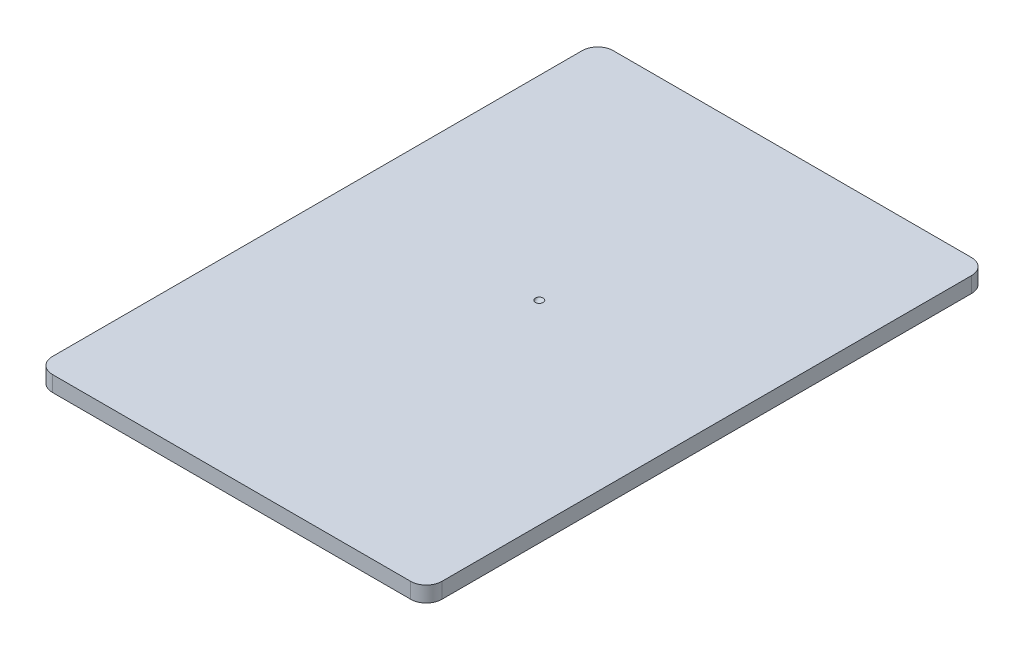
ISO-10303-21;
HEADER;
FILE_DESCRIPTION(('STEP AP214'),'2;1');
FILE_NAME('part.step','',(''),(''),'','','');
FILE_SCHEMA(('AUTOMOTIVE_DESIGN { 1 0 10303 214 1 1 1 1 }'));
ENDSEC;
DATA;
#1=APPLICATION_CONTEXT('core data for automotive mechanical design processes');
#2=APPLICATION_PROTOCOL_DEFINITION('international standard','automotive_design',2000,#1);
#3=PRODUCT_CONTEXT('',#1,'mechanical');
#4=PRODUCT('Part','Part','',(#3));
#5=PRODUCT_RELATED_PRODUCT_CATEGORY('part','',(#4));
#6=PRODUCT_DEFINITION_FORMATION('','',#4);
#7=PRODUCT_DEFINITION_CONTEXT('part definition',#1,'design');
#8=PRODUCT_DEFINITION('design','',#6,#7);
#9=PRODUCT_DEFINITION_SHAPE('','',#8);
#10=(LENGTH_UNIT() NAMED_UNIT(*) SI_UNIT(.MILLI.,.METRE.));
#11=(NAMED_UNIT(*) PLANE_ANGLE_UNIT() SI_UNIT($,.RADIAN.));
#12=(NAMED_UNIT(*) SI_UNIT($,.STERADIAN.) SOLID_ANGLE_UNIT());
#13=UNCERTAINTY_MEASURE_WITH_UNIT(LENGTH_MEASURE(1.E-05),#10,'distance_accuracy_value','');
#14=(GEOMETRIC_REPRESENTATION_CONTEXT(3) GLOBAL_UNCERTAINTY_ASSIGNED_CONTEXT((#13)) GLOBAL_UNIT_ASSIGNED_CONTEXT((#10,
#11,#12)) REPRESENTATION_CONTEXT('',''));
#15=CARTESIAN_POINT('',(0.,0.,0.));
#16=DIRECTION('',(0.,0.,1.));
#17=DIRECTION('',(1.,0.,0.));
#18=AXIS2_PLACEMENT_3D('',#15,#16,#17);
#19=CARTESIAN_POINT('',(0.,0.,0.));
#20=DIRECTION('',(0.,1.,0.));
#21=DIRECTION('',(0.,0.,1.));
#22=AXIS2_PLACEMENT_3D('',#19,#20,#21);
#23=PLANE('',#22);
#24=DIRECTION('',(0.,0.,-1.));
#25=VECTOR('',#24,1.);
#26=CARTESIAN_POINT('',(-25.,0.,0.));
#27=LINE('',#26,#25);
#28=CARTESIAN_POINT('',(-25.,0.,34.));
#29=VERTEX_POINT('',#28);
#30=CARTESIAN_POINT('',(-25.,0.,-34.));
#31=VERTEX_POINT('',#30);
#32=EDGE_CURVE('E102',#29,#31,#27,.T.);
#33=ORIENTED_EDGE('',*,*,#32,.T.);
#34=CARTESIAN_POINT('',(-23.,0.,-34.));
#35=DIRECTION('',(0.,1.,0.));
#36=DIRECTION('',(0.,0.,1.));
#37=AXIS2_PLACEMENT_3D('',#34,#35,#36);
#38=CIRCLE('',#37,2.);
#39=CARTESIAN_POINT('',(-23.,0.,-36.));
#40=VERTEX_POINT('',#39);
#41=EDGE_CURVE('E139',#31,#40,#38,.F.);
#42=ORIENTED_EDGE('',*,*,#41,.T.);
#43=DIRECTION('',(1.,0.,0.));
#44=VECTOR('',#43,1.);
#45=CARTESIAN_POINT('',(0.,0.,-36.));
#46=LINE('',#45,#44);
#47=CARTESIAN_POINT('',(23.,0.,-36.));
#48=VERTEX_POINT('',#47);
#49=EDGE_CURVE('E120',#40,#48,#46,.T.);
#50=ORIENTED_EDGE('',*,*,#49,.T.);
#51=CARTESIAN_POINT('',(23.,0.,-34.));
#52=DIRECTION('',(0.,1.,0.));
#53=DIRECTION('',(0.,0.,1.));
#54=AXIS2_PLACEMENT_3D('',#51,#52,#53);
#55=CIRCLE('',#54,2.);
#56=CARTESIAN_POINT('',(25.,0.,-34.));
#57=VERTEX_POINT('',#56);
#58=EDGE_CURVE('E137',#48,#57,#55,.F.);
#59=ORIENTED_EDGE('',*,*,#58,.T.);
#60=DIRECTION('',(0.,0.,-1.));
#61=VECTOR('',#60,1.);
#62=CARTESIAN_POINT('',(25.,0.,0.));
#63=LINE('',#62,#61);
#64=CARTESIAN_POINT('',(25.,0.,34.));
#65=VERTEX_POINT('',#64);
#66=EDGE_CURVE('E171',#65,#57,#63,.T.);
#67=ORIENTED_EDGE('',*,*,#66,.F.);
#68=CARTESIAN_POINT('',(23.,0.,34.));
#69=DIRECTION('',(0.,1.,0.));
#70=DIRECTION('',(0.,0.,1.));
#71=AXIS2_PLACEMENT_3D('',#68,#69,#70);
#72=CIRCLE('',#71,2.);
#73=CARTESIAN_POINT('',(23.,0.,36.));
#74=VERTEX_POINT('',#73);
#75=EDGE_CURVE('E109',#65,#74,#72,.F.);
#76=ORIENTED_EDGE('',*,*,#75,.T.);
#77=DIRECTION('',(1.,0.,0.));
#78=VECTOR('',#77,1.);
#79=CARTESIAN_POINT('',(0.,0.,36.));
#80=LINE('',#79,#78);
#81=CARTESIAN_POINT('',(-23.,0.,36.));
#82=VERTEX_POINT('',#81);
#83=EDGE_CURVE('E104',#82,#74,#80,.T.);
#84=ORIENTED_EDGE('',*,*,#83,.F.);
#85=CARTESIAN_POINT('',(-23.,0.,34.));
#86=DIRECTION('',(0.,1.,0.));
#87=DIRECTION('',(0.,0.,1.));
#88=AXIS2_PLACEMENT_3D('',#85,#86,#87);
#89=CIRCLE('',#88,2.);
#90=EDGE_CURVE('E99',#82,#29,#89,.F.);
#91=ORIENTED_EDGE('',*,*,#90,.T.);
#92=EDGE_LOOP('',(#33,#42,#50,#59,#67,#76,#84,#91));
#93=FACE_BOUND('',#92,.T.);
#94=CARTESIAN_POINT('',(0.,0.,0.));
#95=CARTESIAN_POINT('',(-0.0771284861220123,0.,-6.51707812193375E-06));
#96=CARTESIAN_POINT('',(-0.154336472293646,0.,-0.00596909769444245));
#97=CARTESIAN_POINT('',(-0.307776338679886,0.,-0.0298357654860756));
#98=CARTESIAN_POINT('',(-0.383986045542524,0.,-0.0478795306023025));
#99=CARTESIAN_POINT('',(-0.532773063591081,0.,-0.0956273852799887));
#100=CARTESIAN_POINT('',(-0.605345617246968,0.,-0.125346319515953));
#101=CARTESIAN_POINT('',(-0.750479253186786,0.,-0.198504140063536));
#102=CARTESIAN_POINT('',(-0.822591055264373,0.,-0.242837834582251));
#103=CARTESIAN_POINT('',(-0.95833876613347,0.,-0.342977215639288));
#104=CARTESIAN_POINT('',(-1.02197514626769,0.,-0.398782263783112));
#105=CARTESIAN_POINT('',(-1.13897895791361,0.,-0.520285887357688));
#106=CARTESIAN_POINT('',(-1.19234614358489,0.,-0.585984699574101));
#107=CARTESIAN_POINT('',(-1.28729318871684,0.,-0.725409726819562));
#108=CARTESIAN_POINT('',(-1.32887295663568,0.,-0.799136004184258));
#109=CARTESIAN_POINT('',(-1.39906465504289,0.,-0.952522541409116));
#110=CARTESIAN_POINT('',(-1.42767663632145,0.,-1.03218277802666));
#111=CARTESIAN_POINT('',(-1.47112065487863,0.,-1.19517612476));
#112=CARTESIAN_POINT('',(-1.48595269122697,0.,-1.27850923512375));
#113=CARTESIAN_POINT('',(-1.5014158174795,0.,-1.44648277737623));
#114=CARTESIAN_POINT('',(-1.50204690366182,0.,-1.53112320960757));
#115=CARTESIAN_POINT('',(-1.48909019936491,0.,-1.69930862621409));
#116=CARTESIAN_POINT('',(-1.4755024172991,0.,-1.78285361123742));
#117=CARTESIAN_POINT('',(-1.43449370620639,0.,-1.94647660285148));
#118=CARTESIAN_POINT('',(-1.40707277512337,0.,-2.02655460892688));
#119=CARTESIAN_POINT('',(-1.33917615329197,0.,-2.18097047332425));
#120=CARTESIAN_POINT('',(-1.2987004586991,0.,-2.25530832995579));
#121=CARTESIAN_POINT('',(-1.20584330333763,0.,-2.39613362907361));
#122=CARTESIAN_POINT('',(-1.1534618436842,0.,-2.4626210722952));
#123=CARTESIAN_POINT('',(-1.03828011772457,0.,-2.58585816261425));
#124=CARTESIAN_POINT('',(-0.975479852534744,0.,-2.6426078107551));
#125=CARTESIAN_POINT('',(-0.841243224103243,0.,-2.74475836618779));
#126=CARTESIAN_POINT('',(-0.769806860556362,0.,-2.79015927307856));
#127=CARTESIAN_POINT('',(-0.620325902553234,0.,-2.86832354640753));
#128=CARTESIAN_POINT('',(-0.542281307856237,0.,-2.90108691238532));
#129=CARTESIAN_POINT('',(-0.381799347014219,0.,-2.95304604585158));
#130=CARTESIAN_POINT('',(-0.299361980895064,0.,-2.97224181341994));
#131=CARTESIAN_POINT('',(-0.132434633322779,0.,-2.99652083859623));
#132=CARTESIAN_POINT('',(-0.0479446519203126,0.,-3.00160409655249));
#133=CARTESIAN_POINT('',(0.120689504536792,0.,-2.99751380483414));
#134=CARTESIAN_POINT('',(0.204833679597694,0.,-2.98834025541782));
#135=CARTESIAN_POINT('',(0.370387624395154,0.,-2.95599675850099));
#136=CARTESIAN_POINT('',(0.451797393965137,0.,-2.93282681014785));
#137=CARTESIAN_POINT('',(0.609571543502221,0.,-2.87314823938117));
#138=CARTESIAN_POINT('',(0.685935923132827,0.,-2.83663961607803));
#139=CARTESIAN_POINT('',(0.831451512192913,0.,-2.75132007676759));
#140=CARTESIAN_POINT('',(0.900602723023714,0.,-2.7025091631503));
#141=CARTESIAN_POINT('',(1.02972898005369,0.,-2.59397064649189));
#142=CARTESIAN_POINT('',(1.08970402786942,0.,-2.53424304537395));
#143=CARTESIAN_POINT('',(1.1987754925542,0.,-2.40556660660667));
#144=CARTESIAN_POINT('',(1.24787190347648,0.,-2.33661776391662));
#145=CARTESIAN_POINT('',(1.33379234840884,0.,-2.1914560859144));
#146=CARTESIAN_POINT('',(1.37061637871639,0.,-2.11524324841072));
#147=CARTESIAN_POINT('',(1.430946731549,0.,-1.95771720758818));
#148=CARTESIAN_POINT('',(1.45445306939016,0.,-1.87640401013515));
#149=CARTESIAN_POINT('',(1.48748064042312,0.,-1.71098516840337));
#150=CARTESIAN_POINT('',(1.49700186898191,0.,-1.62687952319954));
#151=CARTESIAN_POINT('',(1.50178964872937,0.,-1.45826408086242));
#152=CARTESIAN_POINT('',(1.49705619296965,0.,-1.37375428353214));
#153=CARTESIAN_POINT('',(1.47346634552188,0.,-1.20672712530127));
#154=CARTESIAN_POINT('',(1.45461004614398,0.,-1.12420975138137));
#155=CARTESIAN_POINT('',(1.4033196056767,0.,-0.963519397408089));
#156=CARTESIAN_POINT('',(1.37088529371295,0.,-0.885346472042031));
#157=CARTESIAN_POINT('',(1.29332044447567,0.,-0.735520545316213));
#158=CARTESIAN_POINT('',(1.24818938135539,0.,-0.663867814158535));
#159=CARTESIAN_POINT('',(1.17202895487994,0.,-0.562913018810165));
#160=CARTESIAN_POINT('',(1.14522666440903,0.,-0.530344231213826));
#161=CARTESIAN_POINT('',(1.08895106643094,0.,-0.467544416182742));
#162=CARTESIAN_POINT('',(1.05947520955579,0.,-0.437315672078537));
#163=CARTESIAN_POINT('',(0.967414439108499,0.,-0.350563011097985));
#164=CARTESIAN_POINT('',(0.901128988584089,0.,-0.297883590566628));
#165=CARTESIAN_POINT('',(0.760649025392193,0.,-0.204418701180002));
#166=CARTESIAN_POINT('',(0.686454759960461,0.,-0.163632860670909));
#167=CARTESIAN_POINT('',(0.570831240336406,0.,-0.112217406701545));
#168=CARTESIAN_POINT('',(0.53151819841721,0.,-0.0966933817155812));
#169=CARTESIAN_POINT('',(0.45176331268956,0.,-0.0690240868717782));
#170=CARTESIAN_POINT('',(0.411322437736866,0.,-0.0568760096757663));
#171=CARTESIAN_POINT('',(0.288803310425092,0.,-0.025665089552931));
#172=CARTESIAN_POINT('',(0.205322397093662,0.,-0.0117440894001204));
#173=CARTESIAN_POINT('',(0.0810078075464542,0.,-0.00163661143318062));
#174=CARTESIAN_POINT('',(0.0405148720078617,0.,3.42336015962214E-06));
#175=CARTESIAN_POINT('',(0.,0.,0.));
#176=B_SPLINE_CURVE_WITH_KNOTS('',3,(#94,#95,#96,#97,#98,#99,#100,#101,#102,#103,#104,#105,#106,
#107,#108,#109,#110,#111,#112,#113,#114,#115,#116,#117,#118,#119,#120,#121,#122,#123,#124,#125,
#126,#127,#128,#129,#130,#131,#132,#133,#134,#135,#136,#137,#138,#139,#140,#141,#142,#143,#144,
#145,#146,#147,#148,#149,#150,#151,#152,#153,#154,#155,#156,#157,#158,#159,#160,#161,#162,#163,
#164,#165,#166,#167,#168,#169,#170,#171,#172,#173,#174,#175),.UNSPECIFIED.,.T.,.F.,(4,2,2,2,2,2,
2,2,2,2,2,2,2,2,2,2,2,2,2,2,2,2,2,2,2,2,2,2,2,2,2,2,2,2,2,2,2,2,2,2,4),(0.,0.231296164474067,
0.465313752308457,0.699629855489522,0.952363783457064,1.2050836502863,1.45780956637573,
1.71053744509687,1.96326433396462,2.21599123989403,2.4687182120596,2.72144503468463,
2.97417189487417,3.22689882948933,3.47962574043276,3.73235262429638,3.98507951709145,
4.23780641909382,4.49053331960795,4.74326021388407,4.99598710358166,5.24871400867488,
5.50144093062335,5.75416780347382,6.00689463180178,6.25962159828171,6.5123486410085,
6.76507539308429,7.01780222888373,7.27052918787384,7.52325449499688,7.77598298267185,
8.02872193885319,8.15513087299369,8.281661637106,8.53439248369205,8.78711543202937,
8.91378164532131,9.04034220938712,9.29279485106103,9.41429256183874),.UNSPECIFIED.);
#177=CARTESIAN_POINT('',(0.,0.,0.));
#178=VERTEX_POINT('',#177);
#179=EDGE_CURVE('E124',#178,#178,#176,.T.);
#180=ORIENTED_EDGE('',*,*,#179,.F.);
#181=EDGE_LOOP('',(#180));
#182=FACE_BOUND('',#181,.T.);
#183=ADVANCED_FACE('F33',(#93,#182),#23,.F.);
#184=CARTESIAN_POINT('',(0.,2.,36.));
#185=DIRECTION('',(0.,0.,-1.));
#186=DIRECTION('',(-1.,0.,0.));
#187=AXIS2_PLACEMENT_3D('',#184,#185,#186);
#188=PLANE('',#187);
#189=ORIENTED_EDGE('',*,*,#83,.T.);
#190=DIRECTION('',(0.,-1.,0.));
#191=VECTOR('',#190,1.);
#192=CARTESIAN_POINT('',(23.,2.,36.));
#193=LINE('',#192,#191);
#194=CARTESIAN_POINT('',(23.,2.,36.));
#195=VERTEX_POINT('',#194);
#196=EDGE_CURVE('E11',#74,#195,#193,.F.);
#197=ORIENTED_EDGE('',*,*,#196,.T.);
#198=DIRECTION('',(1.,0.,0.));
#199=VECTOR('',#198,1.);
#200=CARTESIAN_POINT('',(0.,2.,36.));
#201=LINE('',#200,#199);
#202=CARTESIAN_POINT('',(-23.,2.,36.));
#203=VERTEX_POINT('',#202);
#204=EDGE_CURVE('E119',#203,#195,#201,.T.);
#205=ORIENTED_EDGE('',*,*,#204,.F.);
#206=DIRECTION('',(0.,-1.,0.));
#207=VECTOR('',#206,1.);
#208=CARTESIAN_POINT('',(-23.,0.,36.));
#209=LINE('',#208,#207);
#210=EDGE_CURVE('E41',#203,#82,#209,.T.);
#211=ORIENTED_EDGE('',*,*,#210,.T.);
#212=EDGE_LOOP('',(#189,#197,#205,#211));
#213=FACE_BOUND('',#212,.T.);
#214=ADVANCED_FACE('F157',(#213),#188,.F.);
#215=CARTESIAN_POINT('',(25.,2.,0.));
#216=DIRECTION('',(-1.,0.,0.));
#217=DIRECTION('',(0.,0.,1.));
#218=AXIS2_PLACEMENT_3D('',#215,#216,#217);
#219=PLANE('',#218);
#220=ORIENTED_EDGE('',*,*,#66,.T.);
#221=DIRECTION('',(0.,-1.,0.));
#222=VECTOR('',#221,1.);
#223=CARTESIAN_POINT('',(25.,2.,-34.));
#224=LINE('',#223,#222);
#225=CARTESIAN_POINT('',(25.,2.,-34.));
#226=VERTEX_POINT('',#225);
#227=EDGE_CURVE('E48',#57,#226,#224,.F.);
#228=ORIENTED_EDGE('',*,*,#227,.T.);
#229=DIRECTION('',(0.,0.,-1.));
#230=VECTOR('',#229,1.);
#231=CARTESIAN_POINT('',(25.,2.,0.));
#232=LINE('',#231,#230);
#233=CARTESIAN_POINT('',(25.,2.,34.));
#234=VERTEX_POINT('',#233);
#235=EDGE_CURVE('E159',#234,#226,#232,.T.);
#236=ORIENTED_EDGE('',*,*,#235,.F.);
#237=DIRECTION('',(0.,-1.,0.));
#238=VECTOR('',#237,1.);
#239=CARTESIAN_POINT('',(25.,2.,34.));
#240=LINE('',#239,#238);
#241=EDGE_CURVE('E152',#234,#65,#240,.T.);
#242=ORIENTED_EDGE('',*,*,#241,.T.);
#243=EDGE_LOOP('',(#220,#228,#236,#242));
#244=FACE_BOUND('',#243,.T.);
#245=ADVANCED_FACE('F202',(#244),#219,.F.);
#246=CARTESIAN_POINT('',(0.,2.,-36.));
#247=DIRECTION('',(0.,0.,-1.));
#248=DIRECTION('',(-1.,0.,0.));
#249=AXIS2_PLACEMENT_3D('',#246,#247,#248);
#250=PLANE('',#249);
#251=ORIENTED_EDGE('',*,*,#49,.F.);
#252=DIRECTION('',(0.,-1.,0.));
#253=VECTOR('',#252,1.);
#254=CARTESIAN_POINT('',(-23.,2.,-36.));
#255=LINE('',#254,#253);
#256=CARTESIAN_POINT('',(-23.,2.,-36.));
#257=VERTEX_POINT('',#256);
#258=EDGE_CURVE('E144',#40,#257,#255,.F.);
#259=ORIENTED_EDGE('',*,*,#258,.T.);
#260=DIRECTION('',(1.,0.,0.));
#261=VECTOR('',#260,1.);
#262=CARTESIAN_POINT('',(0.,2.,-36.));
#263=LINE('',#262,#261);
#264=CARTESIAN_POINT('',(23.,2.,-36.));
#265=VERTEX_POINT('',#264);
#266=EDGE_CURVE('E161',#257,#265,#263,.T.);
#267=ORIENTED_EDGE('',*,*,#266,.T.);
#268=DIRECTION('',(0.,-1.,0.));
#269=VECTOR('',#268,1.);
#270=CARTESIAN_POINT('',(23.,0.,-36.));
#271=LINE('',#270,#269);
#272=EDGE_CURVE('E141',#265,#48,#271,.T.);
#273=ORIENTED_EDGE('',*,*,#272,.T.);
#274=EDGE_LOOP('',(#251,#259,#267,#273));
#275=FACE_BOUND('',#274,.T.);
#276=ADVANCED_FACE('F178',(#275),#250,.T.);
#277=CARTESIAN_POINT('',(-25.,2.,0.));
#278=DIRECTION('',(-1.,0.,0.));
#279=DIRECTION('',(0.,0.,1.));
#280=AXIS2_PLACEMENT_3D('',#277,#278,#279);
#281=PLANE('',#280);
#282=DIRECTION('',(0.,0.,-1.));
#283=VECTOR('',#282,1.);
#284=CARTESIAN_POINT('',(-25.,2.,0.));
#285=LINE('',#284,#283);
#286=CARTESIAN_POINT('',(-25.,2.,34.));
#287=VERTEX_POINT('',#286);
#288=CARTESIAN_POINT('',(-25.,2.,-34.));
#289=VERTEX_POINT('',#288);
#290=EDGE_CURVE('E128',#287,#289,#285,.T.);
#291=ORIENTED_EDGE('',*,*,#290,.T.);
#292=DIRECTION('',(0.,-1.,0.));
#293=VECTOR('',#292,1.);
#294=CARTESIAN_POINT('',(-25.,2.,-34.));
#295=LINE('',#294,#293);
#296=EDGE_CURVE('E110',#289,#31,#295,.T.);
#297=ORIENTED_EDGE('',*,*,#296,.T.);
#298=ORIENTED_EDGE('',*,*,#32,.F.);
#299=DIRECTION('',(0.,-1.,0.));
#300=VECTOR('',#299,1.);
#301=CARTESIAN_POINT('',(-25.,2.,34.));
#302=LINE('',#301,#300);
#303=EDGE_CURVE('E116',#29,#287,#302,.F.);
#304=ORIENTED_EDGE('',*,*,#303,.T.);
#305=EDGE_LOOP('',(#291,#297,#298,#304));
#306=FACE_BOUND('',#305,.T.);
#307=ADVANCED_FACE('F115',(#306),#281,.T.);
#308=CARTESIAN_POINT('',(0.,2.,0.));
#309=DIRECTION('',(0.,1.,0.));
#310=DIRECTION('',(0.,0.,1.));
#311=AXIS2_PLACEMENT_3D('',#308,#309,#310);
#312=PLANE('',#311);
#313=CARTESIAN_POINT('',(0.,2.,-2.99999999999999));
#314=CARTESIAN_POINT('',(0.0260500384834364,2.,-2.99999491610815));
#315=CARTESIAN_POINT('',(0.0520710885146344,2.,-3.0020361859489));
#316=CARTESIAN_POINT('',(0.103516773632853,2.,-3.01014175806723));
#317=CARTESIAN_POINT('',(0.128940842899478,2.,-3.01620972919514));
#318=CARTESIAN_POINT('',(0.180469636024178,2.,-3.03285949527144));
#319=CARTESIAN_POINT('',(0.206472860088435,2.,-3.04375635408386));
#320=CARTESIAN_POINT('',(0.25631870397791,2.,-3.0697765173042));
#321=CARTESIAN_POINT('',(0.280158079550189,2.,-3.08490603348995));
#322=CARTESIAN_POINT('',(0.324939181622952,2.,-3.11894240746596));
#323=CARTESIAN_POINT('',(0.34588309764524,2.,-3.13784638430588));
#324=CARTESIAN_POINT('',(0.384300929549392,2.,-3.17890308483465));
#325=CARTESIAN_POINT('',(0.401774680158694,2.,-3.20105596317068));
#326=CARTESIAN_POINT('',(0.432754095442281,2.,-3.24797967981873));
#327=CARTESIAN_POINT('',(0.446259971801598,2.,-3.27275037837483));
#328=CARTESIAN_POINT('',(0.468922184133025,2.,-3.32420915015182));
#329=CARTESIAN_POINT('',(0.478078262963913,2.,-3.35089733661896));
#330=CARTESIAN_POINT('',(0.491774998070099,2.,-3.40541299919528));
#331=CARTESIAN_POINT('',(0.496318862330157,2.,-3.4332396694087));
#332=CARTESIAN_POINT('',(0.500676455203578,2.,-3.4892984805212));
#333=CARTESIAN_POINT('',(0.500483866404801,2.,-3.51753111275192));
#334=CARTESIAN_POINT('',(0.495360217243896,2.,-3.57354337007692));
#335=CARTESIAN_POINT('',(0.490432416622718,2.,-3.60132329343977));
#336=CARTESIAN_POINT('',(0.475982683893812,2.,-3.65566280384656));
#337=CARTESIAN_POINT('',(0.466460550682604,2.,-3.68222233741577));
#338=CARTESIAN_POINT('',(0.443092962451113,2.,-3.7333644847377));
#339=CARTESIAN_POINT('',(0.429247717769742,2.,-3.75794719459868));
#340=CARTESIAN_POINT('',(0.397625871024022,2.,-3.804440632772));
#341=CARTESIAN_POINT('',(0.379849058584813,2.,-3.82635121800384));
#342=CARTESIAN_POINT('',(0.340885389840486,2.,-3.86686004515771));
#343=CARTESIAN_POINT('',(0.319701358110172,2.,-3.88546100407781));
#344=CARTESIAN_POINT('',(0.274476867684285,2.,-3.91887240827319));
#345=CARTESIAN_POINT('',(0.250431900404238,2.,-3.93367675141766));
#346=CARTESIAN_POINT('',(0.200196373149547,2.,-3.95903493724442));
#347=CARTESIAN_POINT('',(0.174005813174936,2.,-3.96958877992678));
#348=CARTESIAN_POINT('',(0.120266866438408,2.,-3.98613272348156));
#349=CARTESIAN_POINT('',(0.0927207117152057,2.,-3.99213007565321));
#350=CARTESIAN_POINT('',(0.0369895500074511,2.,-3.9994218637452));
#351=CARTESIAN_POINT('',(0.00880403445414705,2.,-4.00071241357905));
#352=CARTESIAN_POINT('',(-0.0473820439109889,2.,-3.99854317794327));
#353=CARTESIAN_POINT('',(-0.0753826165406911,2.,-3.99508364670616));
#354=CARTESIAN_POINT('',(-0.130406928168064,2.,-3.98351262514961));
#355=CARTESIAN_POINT('',(-0.157430619577256,2.,-3.97540090852411));
#356=CARTESIAN_POINT('',(-0.209731377022035,2.,-3.95475610439836));
#357=CARTESIAN_POINT('',(-0.235008519461957,2.,-3.94222321045307));
#358=CARTESIAN_POINT('',(-0.283116640884809,2.,-3.91308159987848));
#359=CARTESIAN_POINT('',(-0.305945923940723,2.,-3.89647008337676));
#360=CARTESIAN_POINT('',(-0.348460890937046,2.,-3.85967257680036));
#361=CARTESIAN_POINT('',(-0.368150722011367,2.,-3.83949137782449));
#362=CARTESIAN_POINT('',(-0.403877866162663,2.,-3.79609642838976));
#363=CARTESIAN_POINT('',(-0.419912634417593,2.,-3.77288058265908));
#364=CARTESIAN_POINT('',(-0.447856069678895,2.,-3.72408770244833));
#365=CARTESIAN_POINT('',(-0.459764960814073,2.,-3.69851079632307));
#366=CARTESIAN_POINT('',(-0.479120328858253,2.,-3.64571937788957));
#367=CARTESIAN_POINT('',(-0.486566584093056,2.,-3.61850478430573));
#368=CARTESIAN_POINT('',(-0.49678413597199,2.,-3.56321302366407));
#369=CARTESIAN_POINT('',(-0.499555642983623,2.,-3.53513589547889));
#370=CARTESIAN_POINT('',(-0.500345914391251,2.,-3.47889535250898));
#371=CARTESIAN_POINT('',(-0.49836140221365,2.,-3.45073189159539));
#372=CARTESIAN_POINT('',(-0.4896950628571,2.,-3.3951758525476));
#373=CARTESIAN_POINT('',(-0.483019497626555,2.,-3.36778229732851));
#374=CARTESIAN_POINT('',(-0.465160889542005,2.,-3.31448518350842));
#375=CARTESIAN_POINT('',(-0.453974774903462,2.,-3.28858265409466));
#376=CARTESIAN_POINT('',(-0.427413092233255,2.,-3.23902404805513));
#377=CARTESIAN_POINT('',(-0.412037650769974,2.,-3.21536790359045));
#378=CARTESIAN_POINT('',(-0.377532757538573,2.,-3.17097211700735));
#379=CARTESIAN_POINT('',(-0.358403212886711,2.,-3.15023254707242));
#380=CARTESIAN_POINT('',(-0.316935388736564,2.,-3.11225963979179));
#381=CARTESIAN_POINT('',(-0.294597171107864,2.,-3.09502623485576));
#382=CARTESIAN_POINT('',(-0.247328680784631,2.,-3.06454746232727));
#383=CARTESIAN_POINT('',(-0.222397182304749,2.,-3.05130399231663));
#384=CARTESIAN_POINT('',(-0.1707052789153,2.,-3.02920133577193));
#385=CARTESIAN_POINT('',(-0.143946596393748,2.,-3.02033808344385));
#386=CARTESIAN_POINT('',(-0.0784722767581805,2.,-3.0046498721615));
#387=CARTESIAN_POINT('',(-0.0392033119372847,2.,-3.00000765086767));
#388=CARTESIAN_POINT('',(0.,2.,-2.99999999999999));
#389=B_SPLINE_CURVE_WITH_KNOTS('',3,(#313,#314,#315,#316,#317,#318,#319,#320,#321,#322,#323,
#324,#325,#326,#327,#328,#329,#330,#331,#332,#333,#334,#335,#336,#337,#338,#339,#340,#341,#342,
#343,#344,#345,#346,#347,#348,#349,#350,#351,#352,#353,#354,#355,#356,#357,#358,#359,#360,#361,
#362,#363,#364,#365,#366,#367,#368,#369,#370,#371,#372,#373,#374,#375,#376,#377,#378,#379,#380,
#381,#382,#383,#384,#385,#386,#387,#388),.UNSPECIFIED.,.T.,.F.,(4,2,2,2,2,2,2,2,2,2,2,2,2,2,2,2,
2,2,2,2,2,2,2,2,2,2,2,2,2,2,2,2,2,2,2,2,2,4),(0.,0.0780200231141217,0.156111230432218,
0.240291431676419,0.324595828382102,0.408836121981662,0.493080426707582,0.57732023620587,
0.661565024977962,0.74575117780274,0.830049622974796,0.914290078263987,0.998534221267468,
1.08277426605116,1.16701881953935,1.251193891129,1.33550341742972,1.41981294372915,
1.50398801531208,1.58823256881245,1.67247261357489,1.75671675655104,1.84095721185605,
1.92525565860945,2.00944180987407,2.09368639756568,2.17792640814557,2.26217060286457,
2.3464110064246,2.43070946257196,2.51489560442518,2.59913917600743,2.68338020269621,
2.7676233139331,2.85186480101357,2.93614628966866,3.02034939915574,3.13776355596948),.UNSPECIFIED.);
#390=CARTESIAN_POINT('',(0.,2.,-2.99999999999999));
#391=VERTEX_POINT('',#390);
#392=EDGE_CURVE('E316',#391,#391,#389,.T.);
#393=ORIENTED_EDGE('',*,*,#392,.F.);
#394=EDGE_LOOP('',(#393));
#395=FACE_BOUND('',#394,.T.);
#396=ORIENTED_EDGE('',*,*,#266,.F.);
#397=CARTESIAN_POINT('',(-23.,2.,-34.));
#398=DIRECTION('',(0.,1.,0.));
#399=DIRECTION('',(0.,0.,1.));
#400=AXIS2_PLACEMENT_3D('',#397,#398,#399);
#401=CIRCLE('',#400,2.);
#402=EDGE_CURVE('E150',#257,#289,#401,.T.);
#403=ORIENTED_EDGE('',*,*,#402,.T.);
#404=ORIENTED_EDGE('',*,*,#290,.F.);
#405=CARTESIAN_POINT('',(-23.,2.,34.));
#406=DIRECTION('',(0.,1.,0.));
#407=DIRECTION('',(0.,0.,1.));
#408=AXIS2_PLACEMENT_3D('',#405,#406,#407);
#409=CIRCLE('',#408,2.);
#410=EDGE_CURVE('E123',#287,#203,#409,.T.);
#411=ORIENTED_EDGE('',*,*,#410,.T.);
#412=ORIENTED_EDGE('',*,*,#204,.T.);
#413=CARTESIAN_POINT('',(23.,2.,34.));
#414=DIRECTION('',(0.,1.,0.));
#415=DIRECTION('',(0.,0.,1.));
#416=AXIS2_PLACEMENT_3D('',#413,#414,#415);
#417=CIRCLE('',#416,2.);
#418=EDGE_CURVE('E55',#195,#234,#417,.T.);
#419=ORIENTED_EDGE('',*,*,#418,.T.);
#420=ORIENTED_EDGE('',*,*,#235,.T.);
#421=CARTESIAN_POINT('',(23.,2.,-34.));
#422=DIRECTION('',(0.,1.,0.));
#423=DIRECTION('',(0.,0.,1.));
#424=AXIS2_PLACEMENT_3D('',#421,#422,#423);
#425=CIRCLE('',#424,2.);
#426=EDGE_CURVE('E148',#226,#265,#425,.T.);
#427=ORIENTED_EDGE('',*,*,#426,.T.);
#428=EDGE_LOOP('',(#396,#403,#404,#411,#412,#419,#420,#427));
#429=FACE_BOUND('',#428,.T.);
#430=ADVANCED_FACE('F184',(#395,#429),#312,.T.);
#431=CARTESIAN_POINT('',(0.,2.,-1.99999999999999));
#432=CARTESIAN_POINT('',(0.,-5.07106781186549,5.07106781186548));
#433=CARTESIAN_POINT('',(3.,2.,-1.99999999999999));
#434=CARTESIAN_POINT('',(3.,-5.07106781186549,5.07106781186547));
#435=CARTESIAN_POINT('',(3.,2.,-4.99999999999999));
#436=CARTESIAN_POINT('',(3.,-5.07106781186549,2.07106781186547));
#437=CARTESIAN_POINT('',(0.,2.,-4.99999999999999));
#438=CARTESIAN_POINT('',(0.,-5.07106781186549,2.07106781186547));
#439=CARTESIAN_POINT('',(-3.,2.,-4.99999999999999));
#440=CARTESIAN_POINT('',(-3.,-5.07106781186549,2.07106781186547));
#441=CARTESIAN_POINT('',(-3.,2.,-1.99999999999999));
#442=CARTESIAN_POINT('',(-3.,-5.07106781186549,5.07106781186547));
#443=CARTESIAN_POINT('',(0.,2.,-1.99999999999999));
#444=CARTESIAN_POINT('',(0.,-5.07106781186549,5.07106781186548));
#445=(BOUNDED_SURFACE() B_SPLINE_SURFACE(3,1,((#431,#432),(#433,#434),(#435,#436),(#437,#438),
(#439,#440),(#441,#442),(#443,#444)),.UNSPECIFIED.,.T.,.F.,.F.) B_SPLINE_SURFACE_WITH_KNOTS((4,
3,4),(2,2),(0.,0.5,1.),(0.,1.),
.UNSPECIFIED.) GEOMETRIC_REPRESENTATION_ITEM() RATIONAL_B_SPLINE_SURFACE(((1.,1.),
(0.333333333333333,0.333333333333333),(0.333333333333333,0.333333333333333),(1.,1.),
(0.333333333333333,0.333333333333333),(0.333333333333333,0.333333333333333),(1.,1.))) REPRESENTATION_ITEM('') SURFACE());
#446=CARTESIAN_POINT('',(0.,-5.07106781186549,3.57106781186547));
#447=DIRECTION('',(0.,1.,0.));
#448=DIRECTION('',(0.,0.,1.));
#449=AXIS2_PLACEMENT_3D('',#446,#447,#448);
#450=CIRCLE('',#449,1.5);
#451=CARTESIAN_POINT('',(0.,-5.07106781186549,5.07106781186548));
#452=VERTEX_POINT('',#451);
#453=EDGE_CURVE('E164',#452,#452,#450,.T.);
#454=CARTESIAN_POINT('',(0.,-5.07106781186549,5.07106781186548));
#455=CARTESIAN_POINT('',(0.,-5.01824418882522,5.01824418882521));
#456=CARTESIAN_POINT('',(0.,-4.96542056578495,4.96542056578494));
#457=CARTESIAN_POINT('',(0.,-4.85977331970442,4.85977331970441));
#458=CARTESIAN_POINT('',(0.,-4.80694969666416,4.80694969666415));
#459=CARTESIAN_POINT('',(0.,-4.70130245058363,4.70130245058362));
#460=CARTESIAN_POINT('',(0.,-4.64847882754336,4.64847882754335));
#461=CARTESIAN_POINT('',(0.,-4.54283158146283,4.54283158146282));
#462=CARTESIAN_POINT('',(0.,-4.49000795842257,4.49000795842256));
#463=CARTESIAN_POINT('',(0.,-4.38436071234203,4.38436071234203));
#464=CARTESIAN_POINT('',(0.,-4.33153708930177,4.33153708930176));
#465=CARTESIAN_POINT('',(0.,-4.22588984322124,4.22588984322123));
#466=CARTESIAN_POINT('',(0.,-4.17306622018097,4.17306622018096));
#467=CARTESIAN_POINT('',(0.,-4.06741897410044,4.06741897410043));
#468=CARTESIAN_POINT('',(0.,-4.01459535106018,4.01459535106017));
#469=CARTESIAN_POINT('',(0.,-3.90894810497965,3.90894810497964));
#470=CARTESIAN_POINT('',(0.,-3.85612448193938,3.85612448193937));
#471=CARTESIAN_POINT('',(0.,-3.75047723585885,3.75047723585884));
#472=CARTESIAN_POINT('',(0.,-3.69765361281858,3.69765361281858));
#473=CARTESIAN_POINT('',(0.,-3.59200636673805,3.59200636673805));
#474=CARTESIAN_POINT('',(0.,-3.53918274369779,3.53918274369778));
#475=CARTESIAN_POINT('',(0.,-3.43353549761726,3.43353549761725));
#476=CARTESIAN_POINT('',(0.,-3.38071187457699,3.38071187457698));
#477=CARTESIAN_POINT('',(0.,-3.27506462849646,3.27506462849645));
#478=CARTESIAN_POINT('',(0.,-3.22224100545619,3.22224100545619));
#479=CARTESIAN_POINT('',(0.,-3.11659375937566,3.11659375937566));
#480=CARTESIAN_POINT('',(0.,-3.0637701363354,3.06377013633539));
#481=CARTESIAN_POINT('',(0.,-2.95812289025487,2.95812289025486));
#482=CARTESIAN_POINT('',(0.,-2.9052992672146,2.9052992672146));
#483=CARTESIAN_POINT('',(0.,-2.79965202113407,2.79965202113407));
#484=CARTESIAN_POINT('',(0.,-2.74682839809381,2.7468283980938));
#485=CARTESIAN_POINT('',(0.,-2.64118115201327,2.64118115201327));
#486=CARTESIAN_POINT('',(0.,-2.58835752897301,2.58835752897301));
#487=CARTESIAN_POINT('',(0.,-2.48271028289248,2.48271028289247));
#488=CARTESIAN_POINT('',(0.,-2.42988665985221,2.42988665985221));
#489=CARTESIAN_POINT('',(0.,-2.32423941377168,2.32423941377168));
#490=CARTESIAN_POINT('',(0.,-2.27141579073142,2.27141579073141));
#491=CARTESIAN_POINT('',(0.,-2.16576854465088,2.16576854465088));
#492=CARTESIAN_POINT('',(0.,-2.11294492161062,2.11294492161062));
#493=CARTESIAN_POINT('',(0.,-2.00729767553009,2.00729767553009));
#494=CARTESIAN_POINT('',(0.,-1.95447405248982,1.95447405248982));
#495=CARTESIAN_POINT('',(0.,-1.84882680640929,1.84882680640929));
#496=CARTESIAN_POINT('',(0.,-1.79600318336903,1.79600318336903));
#497=CARTESIAN_POINT('',(0.,-1.6903559372885,1.69035593728849));
#498=CARTESIAN_POINT('',(0.,-1.63753231424823,1.63753231424823));
#499=CARTESIAN_POINT('',(0.,-1.5318850681677,1.5318850681677));
#500=CARTESIAN_POINT('',(0.,-1.47906144512743,1.47906144512743));
#501=CARTESIAN_POINT('',(0.,-1.3734141990469,1.3734141990469));
#502=CARTESIAN_POINT('',(0.,-1.32059057600664,1.32059057600664));
#503=CARTESIAN_POINT('',(0.,-1.21494332992611,1.21494332992611));
#504=CARTESIAN_POINT('',(0.,-1.16211970688584,1.16211970688584));
#505=CARTESIAN_POINT('',(0.,-1.05647246080531,1.05647246080531));
#506=CARTESIAN_POINT('',(0.,-1.00364883776504,1.00364883776505));
#507=CARTESIAN_POINT('',(0.,-0.898001591684514,0.898001591684516));
#508=CARTESIAN_POINT('',(0.,-0.845177968644248,0.84517796864425));
#509=CARTESIAN_POINT('',(0.,-0.739530722563717,0.73953072256372));
#510=CARTESIAN_POINT('',(0.,-0.686707099523451,0.686707099523454));
#511=CARTESIAN_POINT('',(0.,-0.58105985344292,0.581059853442924));
#512=CARTESIAN_POINT('',(0.,-0.528236230402655,0.528236230402658));
#513=CARTESIAN_POINT('',(0.,-0.422588984322124,0.422588984322127));
#514=CARTESIAN_POINT('',(0.,-0.369765361281858,0.369765361281862));
#515=CARTESIAN_POINT('',(0.,-0.264118115201327,0.264118115201331));
#516=CARTESIAN_POINT('',(0.,-0.211294492161062,0.211294492161066));
#517=CARTESIAN_POINT('',(0.,-0.105647246080531,0.105647246080536));
#518=CARTESIAN_POINT('',(0.,-0.0528236230402654,0.0528236230402704));
#519=CARTESIAN_POINT('',(0.,0.,0.));
#520=B_SPLINE_CURVE_WITH_KNOTS('',3,(#454,#455,#456,#457,#458,#459,#460,#461,#462,#463,#464,
#465,#466,#467,#468,#469,#470,#471,#472,#473,#474,#475,#476,#477,#478,#479,#480,#481,#482,#483,
#484,#485,#486,#487,#488,#489,#490,#491,#492,#493,#494,#495,#496,#497,#498,#499,#500,#501,#502,
#503,#504,#505,#506,#507,#508,#509,#510,#511,#512,#513,#514,#515,#516,#517,#518,#519),
.UNSPECIFIED.,.F.,.F.,(4,2,2,2,2,2,2,2,2,2,2,2,2,2,2,2,2,2,2,2,2,2,2,2,2,2,2,2,2,2,2,2,4),(0.,
0.224111652351682,0.448223304703363,0.672334957055045,0.896446609406727,1.12055826175841,
1.34466991411009,1.56878156646177,1.79289321881345,2.01700487116514,2.24111652351682,
2.4652281758685,2.68933982822018,2.91345148057186,3.13756313292354,3.36167478527523,
3.58578643762691,3.80989808997859,4.03400974233027,4.25812139468195,4.48223304703363,
4.70634469938532,4.930456351737,5.15456800408868,5.37867965644036,5.60279130879204,
5.82690296114372,6.05101461349541,6.27512626584709,6.49923791819877,6.72334957055045,
6.94746122290213,7.17157287525381),.UNSPECIFIED.);
#521=EDGE_CURVE('BSEAM232',#452,#178,#520,.T.);
#522=ORIENTED_EDGE('',*,*,#453,.T.);
#523=ORIENTED_EDGE('',*,*,#179,.T.);
#524=ORIENTED_EDGE('',*,*,#521,.T.);
#525=ORIENTED_EDGE('',*,*,#521,.F.);
#526=EDGE_LOOP('',(#522,#524,#523,#525));
#527=FACE_BOUND('',#526,.T.);
#528=ADVANCED_FACE('F232',(#527),#445,.F.);
#529=CARTESIAN_POINT('',(0.,-5.07106781186549,3.57106781186547));
#530=DIRECTION('',(0.,1.,0.));
#531=DIRECTION('',(0.,0.,1.));
#532=AXIS2_PLACEMENT_3D('',#529,#530,#531);
#533=PLANE('',#532);
#534=CARTESIAN_POINT('',(0.,-5.07106781186549,4.07106781186548));
#535=CARTESIAN_POINT('',(0.0260500384834359,-5.07106781186549,4.07107289575731));
#536=CARTESIAN_POINT('',(0.0520710885146337,-5.07106781186549,4.06903162591656));
#537=CARTESIAN_POINT('',(0.103516773632852,-5.07106781186549,4.06092605379823));
#538=CARTESIAN_POINT('',(0.128940842899478,-5.07106781186549,4.05485808267033));
#539=CARTESIAN_POINT('',(0.180469636024178,-5.07106781186549,4.03820831659403));
#540=CARTESIAN_POINT('',(0.206472860088435,-5.07106781186549,4.02731145778161));
#541=CARTESIAN_POINT('',(0.256318703977909,-5.07106781186549,4.00129129456126));
#542=CARTESIAN_POINT('',(0.280158079550189,-5.07106781186549,3.98616177837552));
#543=CARTESIAN_POINT('',(0.324939181622952,-5.07106781186549,3.95212540439951));
#544=CARTESIAN_POINT('',(0.34588309764524,-5.07106781186549,3.93322142755958));
#545=CARTESIAN_POINT('',(0.384300929549391,-5.07106781186549,3.89216472703081));
#546=CARTESIAN_POINT('',(0.401774680158693,-5.07106781186549,3.87001184869478));
#547=CARTESIAN_POINT('',(0.432754095442281,-5.07106781186549,3.82308813204674));
#548=CARTESIAN_POINT('',(0.446259971801598,-5.07106781186549,3.79831743349064));
#549=CARTESIAN_POINT('',(0.468922184133025,-5.07106781186549,3.74685866171365));
#550=CARTESIAN_POINT('',(0.478078262963913,-5.07106781186549,3.7201704752465));
#551=CARTESIAN_POINT('',(0.491774998070099,-5.07106781186549,3.66565481267018));
#552=CARTESIAN_POINT('',(0.496318862330157,-5.07106781186549,3.63782814245677));
#553=CARTESIAN_POINT('',(0.500676455203577,-5.07106781186549,3.58176933134427));
#554=CARTESIAN_POINT('',(0.5004838664048,-5.07106781186549,3.55353669911355));
#555=CARTESIAN_POINT('',(0.495360217243896,-5.07106781186549,3.49752444178855));
#556=CARTESIAN_POINT('',(0.490432416622718,-5.07106781186549,3.4697445184257));
#557=CARTESIAN_POINT('',(0.475982683893813,-5.07106781186549,3.4154050080189));
#558=CARTESIAN_POINT('',(0.466460550682605,-5.07106781186549,3.3888454744497));
#559=CARTESIAN_POINT('',(0.443092962451113,-5.07106781186549,3.33770332712776));
#560=CARTESIAN_POINT('',(0.429247717769742,-5.07106781186549,3.31312061726678));
#561=CARTESIAN_POINT('',(0.397625871024022,-5.07106781186549,3.26662717909346));
#562=CARTESIAN_POINT('',(0.379849058584812,-5.07106781186549,3.24471659386162));
#563=CARTESIAN_POINT('',(0.340885389840484,-5.07106781186549,3.20420776670775));
#564=CARTESIAN_POINT('',(0.319701358110171,-5.07106781186549,3.18560680778765));
#565=CARTESIAN_POINT('',(0.274476867684284,-5.07106781186549,3.15219540359227));
#566=CARTESIAN_POINT('',(0.250431900404237,-5.07106781186549,3.13739106044781));
#567=CARTESIAN_POINT('',(0.200196373149547,-5.07106781186549,3.11203287462105));
#568=CARTESIAN_POINT('',(0.174005813174936,-5.07106781186549,3.10147903193869));
#569=CARTESIAN_POINT('',(0.120266866438408,-5.07106781186549,3.08493508838391));
#570=CARTESIAN_POINT('',(0.092720711715206,-5.07106781186549,3.07893773621225));
#571=CARTESIAN_POINT('',(0.0369895500074513,-5.07106781186549,3.07164594812026));
#572=CARTESIAN_POINT('',(0.00880403445414702,-5.07106781186549,3.07035539828641));
#573=CARTESIAN_POINT('',(-0.0473820439109889,-5.07106781186549,3.07252463392219));
#574=CARTESIAN_POINT('',(-0.0753826165406909,-5.07106781186549,3.0759841651593));
#575=CARTESIAN_POINT('',(-0.130406928168064,-5.07106781186549,3.08755518671585));
#576=CARTESIAN_POINT('',(-0.157430619577256,-5.07106781186549,3.09566690334136));
#577=CARTESIAN_POINT('',(-0.209731377022034,-5.07106781186549,3.11631170746711));
#578=CARTESIAN_POINT('',(-0.235008519461955,-5.07106781186549,3.1288446014124));
#579=CARTESIAN_POINT('',(-0.283116640884808,-5.07106781186549,3.15798621198698));
#580=CARTESIAN_POINT('',(-0.305945923940723,-5.07106781186549,3.1745977284887));
#581=CARTESIAN_POINT('',(-0.348460890937047,-5.07106781186549,3.2113952350651));
#582=CARTESIAN_POINT('',(-0.368150722011367,-5.07106781186549,3.23157643404097));
#583=CARTESIAN_POINT('',(-0.403877866162663,-5.07106781186549,3.27497138347571));
#584=CARTESIAN_POINT('',(-0.419912634417593,-5.07106781186549,3.29818722920639));
#585=CARTESIAN_POINT('',(-0.447856069678896,-5.07106781186549,3.34698010941714));
#586=CARTESIAN_POINT('',(-0.459764960814073,-5.07106781186549,3.37255701554239));
#587=CARTESIAN_POINT('',(-0.479120328858253,-5.07106781186549,3.4253484339759));
#588=CARTESIAN_POINT('',(-0.486566584093057,-5.07106781186549,3.45256302755973));
#589=CARTESIAN_POINT('',(-0.496784135971991,-5.07106781186549,3.5078547882014));
#590=CARTESIAN_POINT('',(-0.499555642983623,-5.07106781186549,3.53593191638657));
#591=CARTESIAN_POINT('',(-0.500345914391251,-5.07106781186549,3.59217245935649));
#592=CARTESIAN_POINT('',(-0.49836140221365,-5.07106781186549,3.62033592027008));
#593=CARTESIAN_POINT('',(-0.4896950628571,-5.07106781186549,3.67589195931787));
#594=CARTESIAN_POINT('',(-0.483019497626555,-5.07106781186549,3.70328551453695));
#595=CARTESIAN_POINT('',(-0.465160889542006,-5.07106781186549,3.75658262835704));
#596=CARTESIAN_POINT('',(-0.453974774903462,-5.07106781186549,3.7824851577708));
#597=CARTESIAN_POINT('',(-0.427413092233256,-5.07106781186549,3.83204376381033));
#598=CARTESIAN_POINT('',(-0.412037650769974,-5.07106781186549,3.85569990827502));
#599=CARTESIAN_POINT('',(-0.377532757538574,-5.07106781186549,3.90009569485811));
#600=CARTESIAN_POINT('',(-0.358403212886711,-5.07106781186549,3.92083526479305));
#601=CARTESIAN_POINT('',(-0.316935388736565,-5.07106781186549,3.95880817207368));
#602=CARTESIAN_POINT('',(-0.294597171107866,-5.07106781186549,3.97604157700971));
#603=CARTESIAN_POINT('',(-0.247328680784633,-5.07106781186549,4.0065203495382));
#604=CARTESIAN_POINT('',(-0.22239718230475,-5.07106781186549,4.01976381954884));
#605=CARTESIAN_POINT('',(-0.1707052789153,-5.07106781186549,4.04186647609354));
#606=CARTESIAN_POINT('',(-0.143946596393749,-5.07106781186549,4.05072972842161));
#607=CARTESIAN_POINT('',(-0.0784722767581813,-5.07106781186549,4.06641793970397));
#608=CARTESIAN_POINT('',(-0.0392033119372852,-5.07106781186549,4.0710601609978));
#609=CARTESIAN_POINT('',(0.,-5.07106781186549,4.07106781186548));
#610=B_SPLINE_CURVE_WITH_KNOTS('',3,(#534,#535,#536,#537,#538,#539,#540,#541,#542,#543,#544,
#545,#546,#547,#548,#549,#550,#551,#552,#553,#554,#555,#556,#557,#558,#559,#560,#561,#562,#563,
#564,#565,#566,#567,#568,#569,#570,#571,#572,#573,#574,#575,#576,#577,#578,#579,#580,#581,#582,
#583,#584,#585,#586,#587,#588,#589,#590,#591,#592,#593,#594,#595,#596,#597,#598,#599,#600,#601,
#602,#603,#604,#605,#606,#607,#608,#609),.UNSPECIFIED.,.T.,.F.,(4,2,2,2,2,2,2,2,2,2,2,2,2,2,2,2,
2,2,2,2,2,2,2,2,2,2,2,2,2,2,2,2,2,2,2,2,2,4),(0.,0.0780200231141215,0.156111230432217,
0.240291431676419,0.324595828382103,0.408836121981664,0.493080426707583,0.577320236205871,
0.661565024977962,0.74575117780274,0.830049622974794,0.914290078263985,0.998534221267465,
1.08277426605116,1.16701881953935,1.25119389112901,1.33550341742972,1.41981294372915,
1.50398801531208,1.58823256881245,1.67247261357489,1.75671675655104,1.84095721185605,
1.92525565860945,2.00944180987407,2.09368639756568,2.17792640814557,2.26217060286458,
2.34641100642461,2.43070946257196,2.51489560442518,2.59913917600743,2.68338020269621,
2.7676233139331,2.85186480101357,2.93614628966866,3.02034939915575,3.13776355596948),.UNSPECIFIED.);
#611=CARTESIAN_POINT('',(0.,-5.07106781186549,4.07106781186548));
#612=VERTEX_POINT('',#611);
#613=EDGE_CURVE('E320',#612,#612,#610,.T.);
#614=ORIENTED_EDGE('',*,*,#613,.T.);
#615=EDGE_LOOP('',(#614));
#616=FACE_BOUND('',#615,.T.);
#617=ORIENTED_EDGE('',*,*,#453,.F.);
#618=EDGE_LOOP('',(#617));
#619=FACE_BOUND('',#618,.T.);
#620=ADVANCED_FACE('F240',(#616,#619),#533,.F.);
#621=CARTESIAN_POINT('',(0.,3.00251262658471,-4.00251262658469));
#622=CARTESIAN_POINT('',(0.,-6.07358043845019,5.07358043845018));
#623=CARTESIAN_POINT('',(1.,3.00251262658471,-4.00251262658469));
#624=CARTESIAN_POINT('',(1.,-6.07358043845019,5.07358043845018));
#625=CARTESIAN_POINT('',(1.,3.00251262658471,-5.0025126265847));
#626=CARTESIAN_POINT('',(1.,-6.07358043845019,4.07358043845018));
#627=CARTESIAN_POINT('',(0.,3.00251262658471,-5.00251262658469));
#628=CARTESIAN_POINT('',(0.,-6.07358043845019,4.07358043845018));
#629=CARTESIAN_POINT('',(-0.999999999999995,3.00251262658471,-5.0025126265847));
#630=CARTESIAN_POINT('',(-0.999999999999996,-6.07358043845019,4.07358043845018));
#631=CARTESIAN_POINT('',(-0.999999999999995,3.00251262658471,-4.00251262658469));
#632=CARTESIAN_POINT('',(-0.999999999999996,-6.07358043845019,5.07358043845018));
#633=CARTESIAN_POINT('',(0.,3.00251262658471,-4.00251262658469));
#634=CARTESIAN_POINT('',(0.,-6.07358043845019,5.07358043845018));
#635=(BOUNDED_SURFACE() B_SPLINE_SURFACE(3,1,((#621,#622),(#623,#624),(#625,#626),(#627,#628),
(#629,#630),(#631,#632),(#633,#634)),.UNSPECIFIED.,.T.,.F.,.F.) B_SPLINE_SURFACE_WITH_KNOTS((4,
3,4),(2,2),(0.,0.5,1.),(0.,1.),
.UNSPECIFIED.) GEOMETRIC_REPRESENTATION_ITEM() RATIONAL_B_SPLINE_SURFACE(((1.,1.),
(0.333333333333333,0.333333333333333),(0.333333333333333,0.333333333333333),(1.,1.),
(0.333333333333333,0.333333333333333),(0.333333333333333,0.333333333333333),(1.,1.))) REPRESENTATION_ITEM('') SURFACE());
#636=CARTESIAN_POINT('',(0.,-5.07106781186549,4.07106781186548));
#637=CARTESIAN_POINT('',(0.,-4.99741085549189,3.99741085549188));
#638=CARTESIAN_POINT('',(0.,-4.92375389911829,3.92375389911828));
#639=CARTESIAN_POINT('',(0.,-4.77643998637109,3.77643998637108));
#640=CARTESIAN_POINT('',(0.,-4.70278302999749,3.70278302999748));
#641=CARTESIAN_POINT('',(0.,-4.5554691172503,3.55546911725029));
#642=CARTESIAN_POINT('',(0.,-4.4818121608767,3.48181216087669));
#643=CARTESIAN_POINT('',(0.,-4.3344982481295,3.33449824812949));
#644=CARTESIAN_POINT('',(0.,-4.2608412917559,3.26084129175589));
#645=CARTESIAN_POINT('',(0.,-4.1135273790087,3.1135273790087));
#646=CARTESIAN_POINT('',(0.,-4.0398704226351,3.0398704226351));
#647=CARTESIAN_POINT('',(0.,-3.89255650988791,2.8925565098879));
#648=CARTESIAN_POINT('',(0.,-3.81889955351431,2.8188995535143));
#649=CARTESIAN_POINT('',(0.,-3.67158564076711,2.67158564076711));
#650=CARTESIAN_POINT('',(0.,-3.59792868439351,2.59792868439351));
#651=CARTESIAN_POINT('',(0.,-3.45061477164631,2.45061477164631));
#652=CARTESIAN_POINT('',(0.,-3.37695781527271,2.37695781527271));
#653=CARTESIAN_POINT('',(0.,-3.22964390252552,2.22964390252551));
#654=CARTESIAN_POINT('',(0.,-3.15598694615192,2.15598694615191));
#655=CARTESIAN_POINT('',(0.,-3.00867303340472,2.00867303340472));
#656=CARTESIAN_POINT('',(0.,-2.93501607703112,1.93501607703112));
#657=CARTESIAN_POINT('',(0.,-2.78770216428392,1.78770216428392));
#658=CARTESIAN_POINT('',(0.,-2.71404520791033,1.71404520791032));
#659=CARTESIAN_POINT('',(0.,-2.56673129516313,1.56673129516313));
#660=CARTESIAN_POINT('',(0.,-2.49307433878953,1.49307433878953));
#661=CARTESIAN_POINT('',(0.,-2.34576042604233,1.34576042604233));
#662=CARTESIAN_POINT('',(0.,-2.27210346966873,1.27210346966873));
#663=CARTESIAN_POINT('',(0.,-2.12478955692153,1.12478955692153));
#664=CARTESIAN_POINT('',(0.,-2.05113260054794,1.05113260054794));
#665=CARTESIAN_POINT('',(0.,-1.90381868780074,0.903818687800739));
#666=CARTESIAN_POINT('',(0.,-1.83016173142714,0.83016173142714));
#667=CARTESIAN_POINT('',(0.,-1.68284781867994,0.682847818679943));
#668=CARTESIAN_POINT('',(0.,-1.60919086230634,0.609190862306344));
#669=CARTESIAN_POINT('',(0.,-1.46187694955914,0.461876949559147));
#670=CARTESIAN_POINT('',(0.,-1.38821999318555,0.388219993185548));
#671=CARTESIAN_POINT('',(0.,-1.24090608043835,0.240906080438351));
#672=CARTESIAN_POINT('',(0.,-1.16724912406475,0.167249124064752));
#673=CARTESIAN_POINT('',(0.,-1.01993521131755,0.0199352113175549));
#674=CARTESIAN_POINT('',(0.,-0.946278254943953,-0.0537217450560437));
#675=CARTESIAN_POINT('',(0.,-0.798964342196755,-0.201035657803241));
#676=CARTESIAN_POINT('',(0.,-0.725307385823157,-0.274692614176839));
#677=CARTESIAN_POINT('',(0.,-0.577993473075959,-0.422006526924037));
#678=CARTESIAN_POINT('',(0.,-0.504336516702361,-0.495663483297635));
#679=CARTESIAN_POINT('',(0.,-0.357022603955163,-0.642977396044832));
#680=CARTESIAN_POINT('',(0.,-0.283365647581564,-0.716634352418431));
#681=CARTESIAN_POINT('',(0.,-0.136051734834367,-0.863948265165628));
#682=CARTESIAN_POINT('',(0.,-0.0623947784607675,-0.937605221539226));
#683=CARTESIAN_POINT('',(0.,0.0849191342864302,-1.08491913428642));
#684=CARTESIAN_POINT('',(0.,0.158576090660029,-1.15857609066002));
#685=CARTESIAN_POINT('',(0.,0.305890003407227,-1.30589000340722));
#686=CARTESIAN_POINT('',(0.,0.379546959780826,-1.37954695978082));
#687=CARTESIAN_POINT('',(0.,0.526860872528023,-1.52686087252802));
#688=CARTESIAN_POINT('',(0.,0.600517828901622,-1.60051782890161));
#689=CARTESIAN_POINT('',(0.,0.74783174164882,-1.74783174164881));
#690=CARTESIAN_POINT('',(0.,0.821488698022419,-1.82148869802241));
#691=CARTESIAN_POINT('',(0.,0.968802610769616,-1.96880261076961));
#692=CARTESIAN_POINT('',(0.,1.04245956714321,-2.04245956714321));
#693=CARTESIAN_POINT('',(0.,1.18977347989041,-2.1897734798904));
#694=CARTESIAN_POINT('',(0.,1.26343043626401,-2.263430436264));
#695=CARTESIAN_POINT('',(0.,1.41074434901121,-2.4107443490112));
#696=CARTESIAN_POINT('',(0.,1.48440130538481,-2.4844013053848));
#697=CARTESIAN_POINT('',(0.,1.63171521813201,-2.63171521813199));
#698=CARTESIAN_POINT('',(0.,1.7053721745056,-2.70537217450559));
#699=CARTESIAN_POINT('',(0.,1.8526860872528,-2.85268608725279));
#700=CARTESIAN_POINT('',(0.,1.9263430436264,-2.92634304362639));
#701=CARTESIAN_POINT('',(0.,2.,-2.99999999999999));
#702=B_SPLINE_CURVE_WITH_KNOTS('',3,(#636,#637,#638,#639,#640,#641,#642,#643,#644,#645,#646,
#647,#648,#649,#650,#651,#652,#653,#654,#655,#656,#657,#658,#659,#660,#661,#662,#663,#664,#665,
#666,#667,#668,#669,#670,#671,#672,#673,#674,#675,#676,#677,#678,#679,#680,#681,#682,#683,#684,
#685,#686,#687,#688,#689,#690,#691,#692,#693,#694,#695,#696,#697,#698,#699,#700,#701),
.UNSPECIFIED.,.F.,.F.,(4,2,2,2,2,2,2,2,2,2,2,2,2,2,2,2,2,2,2,2,2,2,2,2,2,2,2,2,2,2,2,2,4),(0.,
0.3125,0.625,0.9375,1.25,1.5625,1.875,2.1875,2.5,2.8125,3.125,3.4375,3.75,4.0625,4.375,4.6875,
5.,5.3125,5.625,5.9375,6.25,6.5625,6.875,7.1875,7.5,7.8125,8.125,8.4375,8.75,9.0625,9.375,
9.6875,10.),.UNSPECIFIED.);
#703=EDGE_CURVE('BSEAM196',#612,#391,#702,.T.);
#704=ORIENTED_EDGE('',*,*,#613,.F.);
#705=ORIENTED_EDGE('',*,*,#392,.T.);
#706=ORIENTED_EDGE('',*,*,#703,.T.);
#707=ORIENTED_EDGE('',*,*,#703,.F.);
#708=EDGE_LOOP('',(#704,#706,#705,#707));
#709=FACE_BOUND('',#708,.T.);
#710=ADVANCED_FACE('F196',(#709),#635,.T.);
#711=CARTESIAN_POINT('',(-23.,2.,-34.));
#712=DIRECTION('',(0.,-1.,0.));
#713=DIRECTION('',(0.,0.,-1.));
#714=AXIS2_PLACEMENT_3D('',#711,#712,#713);
#715=CYLINDRICAL_SURFACE('',#714,2.);
#716=ORIENTED_EDGE('',*,*,#402,.F.);
#717=ORIENTED_EDGE('',*,*,#258,.F.);
#718=ORIENTED_EDGE('',*,*,#41,.F.);
#719=ORIENTED_EDGE('',*,*,#296,.F.);
#720=EDGE_LOOP('',(#716,#717,#718,#719));
#721=FACE_BOUND('',#720,.T.);
#722=ADVANCED_FACE('F183',(#721),#715,.T.);
#723=CARTESIAN_POINT('',(23.,2.,-34.));
#724=DIRECTION('',(0.,1.,0.));
#725=DIRECTION('',(0.,0.,1.));
#726=AXIS2_PLACEMENT_3D('',#723,#724,#725);
#727=CYLINDRICAL_SURFACE('',#726,2.);
#728=ORIENTED_EDGE('',*,*,#426,.F.);
#729=ORIENTED_EDGE('',*,*,#227,.F.);
#730=ORIENTED_EDGE('',*,*,#58,.F.);
#731=ORIENTED_EDGE('',*,*,#272,.F.);
#732=EDGE_LOOP('',(#728,#729,#730,#731));
#733=FACE_BOUND('',#732,.T.);
#734=ADVANCED_FACE('F187',(#733),#727,.T.);
#735=CARTESIAN_POINT('',(23.,2.,34.));
#736=DIRECTION('',(0.,-1.,0.));
#737=DIRECTION('',(0.,0.,-1.));
#738=AXIS2_PLACEMENT_3D('',#735,#736,#737);
#739=CYLINDRICAL_SURFACE('',#738,2.);
#740=ORIENTED_EDGE('',*,*,#418,.F.);
#741=ORIENTED_EDGE('',*,*,#196,.F.);
#742=ORIENTED_EDGE('',*,*,#75,.F.);
#743=ORIENTED_EDGE('',*,*,#241,.F.);
#744=EDGE_LOOP('',(#740,#741,#742,#743));
#745=FACE_BOUND('',#744,.T.);
#746=ADVANCED_FACE('F189',(#745),#739,.T.);
#747=CARTESIAN_POINT('',(-23.,2.,34.));
#748=DIRECTION('',(0.,1.,0.));
#749=DIRECTION('',(0.,0.,1.));
#750=AXIS2_PLACEMENT_3D('',#747,#748,#749);
#751=CYLINDRICAL_SURFACE('',#750,2.);
#752=ORIENTED_EDGE('',*,*,#410,.F.);
#753=ORIENTED_EDGE('',*,*,#303,.F.);
#754=ORIENTED_EDGE('',*,*,#90,.F.);
#755=ORIENTED_EDGE('',*,*,#210,.F.);
#756=EDGE_LOOP('',(#752,#753,#754,#755));
#757=FACE_BOUND('',#756,.T.);
#758=ADVANCED_FACE('F35',(#757),#751,.T.);
#759=CLOSED_SHELL('',(#183,#214,#245,#276,#307,#430,#528,#620,#710,#722,#734,#746,#758));
#760=MANIFOLD_SOLID_BREP('B2',#759);
#761=ADVANCED_BREP_SHAPE_REPRESENTATION('',(#18,#760),#14);
#762=SHAPE_DEFINITION_REPRESENTATION(#9,#761);
ENDSEC;
END-ISO-10303-21;
